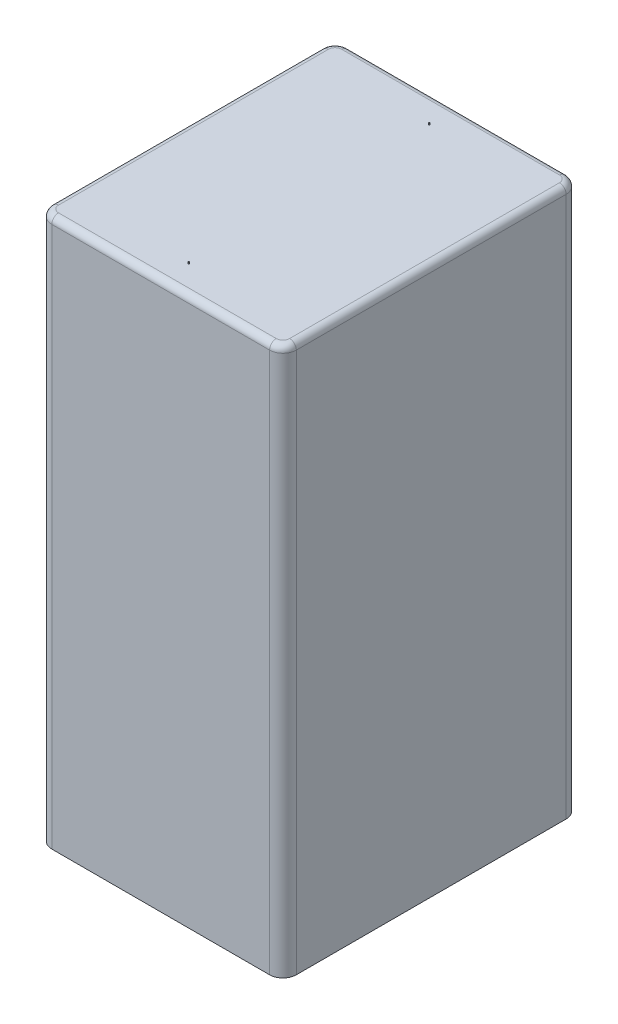
ISO-10303-21;
HEADER;
FILE_DESCRIPTION(('STEP AP214'),'2;1');
FILE_NAME('part.step','',(''),(''),'','','');
FILE_SCHEMA(('AUTOMOTIVE_DESIGN { 1 0 10303 214 1 1 1 1 }'));
ENDSEC;
DATA;
#1=APPLICATION_CONTEXT('core data for automotive mechanical design processes');
#2=APPLICATION_PROTOCOL_DEFINITION('international standard','automotive_design',2000,#1);
#3=PRODUCT_CONTEXT('',#1,'mechanical');
#4=PRODUCT('Part','Part','',(#3));
#5=PRODUCT_RELATED_PRODUCT_CATEGORY('part','',(#4));
#6=PRODUCT_DEFINITION_FORMATION('','',#4);
#7=PRODUCT_DEFINITION_CONTEXT('part definition',#1,'design');
#8=PRODUCT_DEFINITION('design','',#6,#7);
#9=PRODUCT_DEFINITION_SHAPE('','',#8);
#10=(LENGTH_UNIT() NAMED_UNIT(*) SI_UNIT(.MILLI.,.METRE.));
#11=(NAMED_UNIT(*) PLANE_ANGLE_UNIT() SI_UNIT($,.RADIAN.));
#12=(NAMED_UNIT(*) SI_UNIT($,.STERADIAN.) SOLID_ANGLE_UNIT());
#13=UNCERTAINTY_MEASURE_WITH_UNIT(LENGTH_MEASURE(1.E-05),#10,'distance_accuracy_value','');
#14=(GEOMETRIC_REPRESENTATION_CONTEXT(3) GLOBAL_UNCERTAINTY_ASSIGNED_CONTEXT((#13)) GLOBAL_UNIT_ASSIGNED_CONTEXT((#10,
#11,#12)) REPRESENTATION_CONTEXT('',''));
#15=CARTESIAN_POINT('',(0.,0.,0.));
#16=DIRECTION('',(0.,0.,1.));
#17=DIRECTION('',(1.,0.,0.));
#18=AXIS2_PLACEMENT_3D('',#15,#16,#17);
#19=CARTESIAN_POINT('',(140.172243546169,859.000000000009,970.336150462191));
#20=DIRECTION('',(0.,1.,0.));
#21=DIRECTION('',(-1.,0.,0.));
#22=AXIS2_PLACEMENT_3D('',#19,#20,#21);
#23=PLANE('',#22);
#24=CARTESIAN_POINT('',(-42.8277564538314,859.000000000009,928.336150462191));
#25=DIRECTION('',(0.,1.,0.));
#26=DIRECTION('',(-1.,0.,0.));
#27=AXIS2_PLACEMENT_3D('',#24,#25,#26);
#28=CIRCLE('',#27,1.);
#29=CARTESIAN_POINT('',(-43.8277564538314,859.000000000009,928.336150462191));
#30=VERTEX_POINT('',#29);
#31=EDGE_CURVE('E200',#30,#30,#28,.T.);
#32=ORIENTED_EDGE('',*,*,#31,.F.);
#33=EDGE_LOOP('',(#32));
#34=FACE_BOUND('',#33,.T.);
#35=DIRECTION('',(0.,0.,-1.));
#36=VECTOR('',#35,1.);
#37=CARTESIAN_POINT('',(-215.827756453831,859.000000000009,950.33615046219));
#38=LINE('',#37,#36);
#39=CARTESIAN_POINT('',(-215.827756453831,859.000000000009,546.33615046219));
#40=VERTEX_POINT('',#39);
#41=CARTESIAN_POINT('',(-215.827756453831,859.000000000009,950.33615046219));
#42=VERTEX_POINT('',#41);
#43=EDGE_CURVE('E270',#40,#42,#38,.F.);
#44=ORIENTED_EDGE('',*,*,#43,.T.);
#45=CARTESIAN_POINT('',(-205.827756453831,859.000000000009,950.33615046219));
#46=DIRECTION('',(0.,1.,0.));
#47=DIRECTION('',(-1.,0.,0.));
#48=AXIS2_PLACEMENT_3D('',#45,#46,#47);
#49=CIRCLE('',#48,10.);
#50=CARTESIAN_POINT('',(-205.827756453831,859.000000000009,960.33615046219));
#51=VERTEX_POINT('',#50);
#52=EDGE_CURVE('E272',#42,#51,#49,.T.);
#53=ORIENTED_EDGE('',*,*,#52,.T.);
#54=DIRECTION('',(-1.,0.,0.));
#55=VECTOR('',#54,1.);
#56=CARTESIAN_POINT('',(120.172243546169,859.000000000009,960.336150462191));
#57=LINE('',#56,#55);
#58=CARTESIAN_POINT('',(120.172243546169,859.000000000009,960.336150462191));
#59=VERTEX_POINT('',#58);
#60=EDGE_CURVE('E258',#51,#59,#57,.F.);
#61=ORIENTED_EDGE('',*,*,#60,.T.);
#62=CARTESIAN_POINT('',(120.172243546169,859.000000000009,950.336150462191));
#63=DIRECTION('',(0.,1.,0.));
#64=DIRECTION('',(-1.,0.,0.));
#65=AXIS2_PLACEMENT_3D('',#62,#63,#64);
#66=CIRCLE('',#65,10.);
#67=CARTESIAN_POINT('',(130.172243546169,859.000000000009,950.336150462191));
#68=VERTEX_POINT('',#67);
#69=EDGE_CURVE('E260',#59,#68,#66,.T.);
#70=ORIENTED_EDGE('',*,*,#69,.T.);
#71=DIRECTION('',(0.,0.,1.));
#72=VECTOR('',#71,1.);
#73=CARTESIAN_POINT('',(130.172243546169,859.000000000009,546.336150462191));
#74=LINE('',#73,#72);
#75=CARTESIAN_POINT('',(130.172243546169,859.000000000009,546.336150462191));
#76=VERTEX_POINT('',#75);
#77=EDGE_CURVE('E262',#68,#76,#74,.F.);
#78=ORIENTED_EDGE('',*,*,#77,.T.);
#79=CARTESIAN_POINT('',(120.172243546169,859.000000000009,546.336150462191));
#80=DIRECTION('',(0.,1.,0.));
#81=DIRECTION('',(-1.,0.,0.));
#82=AXIS2_PLACEMENT_3D('',#79,#80,#81);
#83=CIRCLE('',#82,10.);
#84=CARTESIAN_POINT('',(120.172243546169,859.000000000009,536.336150462191));
#85=VERTEX_POINT('',#84);
#86=EDGE_CURVE('E264',#76,#85,#83,.T.);
#87=ORIENTED_EDGE('',*,*,#86,.T.);
#88=DIRECTION('',(1.,0.,0.));
#89=VECTOR('',#88,1.);
#90=CARTESIAN_POINT('',(-205.827756453831,859.000000000009,536.33615046219));
#91=LINE('',#90,#89);
#92=CARTESIAN_POINT('',(-205.827756453831,859.000000000009,536.33615046219));
#93=VERTEX_POINT('',#92);
#94=EDGE_CURVE('E266',#85,#93,#91,.F.);
#95=ORIENTED_EDGE('',*,*,#94,.T.);
#96=CARTESIAN_POINT('',(-205.827756453831,859.000000000009,546.33615046219));
#97=DIRECTION('',(0.,1.,0.));
#98=DIRECTION('',(-1.,0.,0.));
#99=AXIS2_PLACEMENT_3D('',#96,#97,#98);
#100=CIRCLE('',#99,10.);
#101=EDGE_CURVE('E268',#93,#40,#100,.T.);
#102=ORIENTED_EDGE('',*,*,#101,.T.);
#103=EDGE_LOOP('',(#44,#53,#61,#70,#78,#87,#95,#102));
#104=FACE_BOUND('',#103,.T.);
#105=CARTESIAN_POINT('',(-42.8277564538313,859.000000000009,568.33615046219));
#106=DIRECTION('',(0.,1.,0.));
#107=DIRECTION('',(-1.,0.,0.));
#108=AXIS2_PLACEMENT_3D('',#105,#106,#107);
#109=CIRCLE('',#108,1.);
#110=CARTESIAN_POINT('',(-43.8277564538313,859.000000000009,568.33615046219));
#111=VERTEX_POINT('',#110);
#112=EDGE_CURVE('E196',#111,#111,#109,.T.);
#113=ORIENTED_EDGE('',*,*,#112,.F.);
#114=EDGE_LOOP('',(#113));
#115=FACE_BOUND('',#114,.T.);
#116=ADVANCED_FACE('F42',(#34,#104,#115),#23,.T.);
#117=CARTESIAN_POINT('',(140.172243546169,59.0000000000093,526.336150462191));
#118=DIRECTION('',(-1.,0.,0.));
#119=DIRECTION('',(0.,-1.,0.));
#120=AXIS2_PLACEMENT_3D('',#117,#118,#119);
#121=PLANE('',#120);
#122=DIRECTION('',(0.,1.,0.));
#123=VECTOR('',#122,1.);
#124=CARTESIAN_POINT('',(140.172243546169,59.0000000000093,546.336150462191));
#125=LINE('',#124,#123);
#126=CARTESIAN_POINT('',(140.172243546169,39.0000000000092,546.336150462191));
#127=VERTEX_POINT('',#126);
#128=CARTESIAN_POINT('',(140.172243546169,849.000000000009,546.336150462191));
#129=VERTEX_POINT('',#128);
#130=EDGE_CURVE('E156',#127,#129,#125,.T.);
#131=ORIENTED_EDGE('',*,*,#130,.T.);
#132=DIRECTION('',(0.,0.,1.));
#133=VECTOR('',#132,1.);
#134=CARTESIAN_POINT('',(140.172243546169,849.000000000009,950.336150462191));
#135=LINE('',#134,#133);
#136=CARTESIAN_POINT('',(140.172243546169,849.000000000009,950.336150462191));
#137=VERTEX_POINT('',#136);
#138=EDGE_CURVE('E67',#129,#137,#135,.T.);
#139=ORIENTED_EDGE('',*,*,#138,.T.);
#140=DIRECTION('',(0.,1.,0.));
#141=VECTOR('',#140,1.);
#142=CARTESIAN_POINT('',(140.172243546169,59.0000000000093,950.336150462191));
#143=LINE('',#142,#141);
#144=CARTESIAN_POINT('',(140.172243546169,39.0000000000093,950.336150462191));
#145=VERTEX_POINT('',#144);
#146=EDGE_CURVE('E165',#137,#145,#143,.F.);
#147=ORIENTED_EDGE('',*,*,#146,.T.);
#148=DIRECTION('',(0.,0.,1.));
#149=VECTOR('',#148,1.);
#150=CARTESIAN_POINT('',(140.172243546169,39.0000000000092,546.336150462191));
#151=LINE('',#150,#149);
#152=EDGE_CURVE('E169',#127,#145,#151,.T.);
#153=ORIENTED_EDGE('',*,*,#152,.F.);
#154=EDGE_LOOP('',(#131,#139,#147,#153));
#155=FACE_BOUND('',#154,.T.);
#156=ADVANCED_FACE('F170',(#155),#121,.F.);
#157=CARTESIAN_POINT('',(-225.827756453831,59.0000000000091,970.336150462191));
#158=DIRECTION('',(0.,0.,-1.));
#159=DIRECTION('',(0.,1.,0.));
#160=AXIS2_PLACEMENT_3D('',#157,#158,#159);
#161=PLANE('',#160);
#162=DIRECTION('',(0.,1.,0.));
#163=VECTOR('',#162,1.);
#164=CARTESIAN_POINT('',(120.172243546169,59.0000000000092,970.336150462191));
#165=LINE('',#164,#163);
#166=CARTESIAN_POINT('',(120.172243546169,39.0000000000093,970.336150462191));
#167=VERTEX_POINT('',#166);
#168=CARTESIAN_POINT('',(120.172243546169,849.000000000009,970.336150462191));
#169=VERTEX_POINT('',#168);
#170=EDGE_CURVE('E166',#167,#169,#165,.T.);
#171=ORIENTED_EDGE('',*,*,#170,.T.);
#172=DIRECTION('',(-1.,0.,0.));
#173=VECTOR('',#172,1.);
#174=CARTESIAN_POINT('',(-205.827756453831,849.000000000009,970.336150462191));
#175=LINE('',#174,#173);
#176=CARTESIAN_POINT('',(-205.827756453831,849.000000000009,970.336150462191));
#177=VERTEX_POINT('',#176);
#178=EDGE_CURVE('E12',#169,#177,#175,.T.);
#179=ORIENTED_EDGE('',*,*,#178,.T.);
#180=DIRECTION('',(0.,1.,0.));
#181=VECTOR('',#180,1.);
#182=CARTESIAN_POINT('',(-205.827756453831,59.0000000000091,970.336150462191));
#183=LINE('',#182,#181);
#184=CARTESIAN_POINT('',(-205.827756453831,39.0000000000091,970.336150462191));
#185=VERTEX_POINT('',#184);
#186=EDGE_CURVE('E244',#177,#185,#183,.F.);
#187=ORIENTED_EDGE('',*,*,#186,.T.);
#188=DIRECTION('',(-1.,0.,0.));
#189=VECTOR('',#188,1.);
#190=CARTESIAN_POINT('',(120.172243546169,39.0000000000093,970.336150462191));
#191=LINE('',#190,#189);
#192=EDGE_CURVE('E184',#167,#185,#191,.T.);
#193=ORIENTED_EDGE('',*,*,#192,.F.);
#194=EDGE_LOOP('',(#171,#179,#187,#193));
#195=FACE_BOUND('',#194,.T.);
#196=ADVANCED_FACE('F327',(#195),#161,.F.);
#197=CARTESIAN_POINT('',(-225.827756453831,59.0000000000091,526.336150462191));
#198=DIRECTION('',(1.,0.,0.));
#199=DIRECTION('',(0.,1.,0.));
#200=AXIS2_PLACEMENT_3D('',#197,#198,#199);
#201=PLANE('',#200);
#202=DIRECTION('',(0.,1.,0.));
#203=VECTOR('',#202,1.);
#204=CARTESIAN_POINT('',(-225.827756453831,59.0000000000091,950.336150462191));
#205=LINE('',#204,#203);
#206=CARTESIAN_POINT('',(-225.827756453831,39.0000000000091,950.336150462191));
#207=VERTEX_POINT('',#206);
#208=CARTESIAN_POINT('',(-225.827756453831,849.000000000009,950.33615046219));
#209=VERTEX_POINT('',#208);
#210=EDGE_CURVE('E253',#207,#209,#205,.T.);
#211=ORIENTED_EDGE('',*,*,#210,.T.);
#212=DIRECTION('',(0.,0.,-1.));
#213=VECTOR('',#212,1.);
#214=CARTESIAN_POINT('',(-225.827756453831,849.000000000009,546.33615046219));
#215=LINE('',#214,#213);
#216=CARTESIAN_POINT('',(-225.827756453831,849.000000000009,546.33615046219));
#217=VERTEX_POINT('',#216);
#218=EDGE_CURVE('E278',#209,#217,#215,.T.);
#219=ORIENTED_EDGE('',*,*,#218,.T.);
#220=DIRECTION('',(0.,1.,0.));
#221=VECTOR('',#220,1.);
#222=CARTESIAN_POINT('',(-225.827756453831,59.0000000000091,546.33615046219));
#223=LINE('',#222,#221);
#224=CARTESIAN_POINT('',(-225.827756453831,39.0000000000091,546.33615046219));
#225=VERTEX_POINT('',#224);
#226=EDGE_CURVE('E256',#217,#225,#223,.F.);
#227=ORIENTED_EDGE('',*,*,#226,.T.);
#228=DIRECTION('',(0.,0.,-1.));
#229=VECTOR('',#228,1.);
#230=CARTESIAN_POINT('',(-225.827756453831,39.0000000000091,950.336150462191));
#231=LINE('',#230,#229);
#232=EDGE_CURVE('E190',#207,#225,#231,.T.);
#233=ORIENTED_EDGE('',*,*,#232,.F.);
#234=EDGE_LOOP('',(#211,#219,#227,#233));
#235=FACE_BOUND('',#234,.T.);
#236=ADVANCED_FACE('F344',(#235),#201,.F.);
#237=CARTESIAN_POINT('',(-225.827756453831,59.0000000000091,526.336150462191));
#238=DIRECTION('',(0.,0.,1.));
#239=DIRECTION('',(0.,-1.,0.));
#240=AXIS2_PLACEMENT_3D('',#237,#238,#239);
#241=PLANE('',#240);
#242=DIRECTION('',(0.,1.,0.));
#243=VECTOR('',#242,1.);
#244=CARTESIAN_POINT('',(-205.827756453831,59.0000000000091,526.336150462191));
#245=LINE('',#244,#243);
#246=CARTESIAN_POINT('',(-205.827756453831,39.0000000000091,526.336150462191));
#247=VERTEX_POINT('',#246);
#248=CARTESIAN_POINT('',(-205.827756453831,849.000000000009,526.33615046219));
#249=VERTEX_POINT('',#248);
#250=EDGE_CURVE('E248',#247,#249,#245,.T.);
#251=ORIENTED_EDGE('',*,*,#250,.T.);
#252=DIRECTION('',(1.,0.,0.));
#253=VECTOR('',#252,1.);
#254=CARTESIAN_POINT('',(120.172243546169,849.000000000009,526.336150462191));
#255=LINE('',#254,#253);
#256=CARTESIAN_POINT('',(120.172243546169,849.000000000009,526.336150462191));
#257=VERTEX_POINT('',#256);
#258=EDGE_CURVE('E282',#249,#257,#255,.T.);
#259=ORIENTED_EDGE('',*,*,#258,.T.);
#260=DIRECTION('',(0.,1.,0.));
#261=VECTOR('',#260,1.);
#262=CARTESIAN_POINT('',(120.172243546169,59.0000000000092,526.336150462191));
#263=LINE('',#262,#261);
#264=CARTESIAN_POINT('',(120.172243546169,39.0000000000092,526.336150462191));
#265=VERTEX_POINT('',#264);
#266=EDGE_CURVE('E251',#257,#265,#263,.F.);
#267=ORIENTED_EDGE('',*,*,#266,.T.);
#268=DIRECTION('',(1.,0.,0.));
#269=VECTOR('',#268,1.);
#270=CARTESIAN_POINT('',(-205.827756453831,39.0000000000091,526.336150462191));
#271=LINE('',#270,#269);
#272=EDGE_CURVE('E180',#247,#265,#271,.T.);
#273=ORIENTED_EDGE('',*,*,#272,.F.);
#274=EDGE_LOOP('',(#251,#259,#267,#273));
#275=FACE_BOUND('',#274,.T.);
#276=ADVANCED_FACE('F406',(#275),#241,.F.);
#277=CARTESIAN_POINT('',(120.172243546169,59.0000000000092,950.336150462191));
#278=DIRECTION('',(0.,1.,0.));
#279=DIRECTION('',(-1.,0.,0.));
#280=AXIS2_PLACEMENT_3D('',#277,#278,#279);
#281=CYLINDRICAL_SURFACE('',#280,20.);
#282=ORIENTED_EDGE('',*,*,#146,.F.);
#283=CARTESIAN_POINT('',(120.172243546169,849.000000000009,950.336150462191));
#284=DIRECTION('',(0.,1.,0.));
#285=DIRECTION('',(-1.,0.,0.));
#286=AXIS2_PLACEMENT_3D('',#283,#284,#285);
#287=CIRCLE('',#286,20.);
#288=EDGE_CURVE('E52',#137,#169,#287,.F.);
#289=ORIENTED_EDGE('',*,*,#288,.T.);
#290=ORIENTED_EDGE('',*,*,#170,.F.);
#291=CARTESIAN_POINT('',(120.172243546169,39.0000000000093,950.336150462191));
#292=DIRECTION('',(0.,-1.,0.));
#293=DIRECTION('',(1.,0.,0.));
#294=AXIS2_PLACEMENT_3D('',#291,#292,#293);
#295=CIRCLE('',#294,20.);
#296=EDGE_CURVE('E174',#145,#167,#295,.T.);
#297=ORIENTED_EDGE('',*,*,#296,.F.);
#298=EDGE_LOOP('',(#282,#289,#290,#297));
#299=FACE_BOUND('',#298,.T.);
#300=ADVANCED_FACE('F409',(#299),#281,.T.);
#301=CARTESIAN_POINT('',(120.172243546169,59.0000000000092,546.336150462191));
#302=DIRECTION('',(0.,1.,0.));
#303=DIRECTION('',(-1.,0.,0.));
#304=AXIS2_PLACEMENT_3D('',#301,#302,#303);
#305=CYLINDRICAL_SURFACE('',#304,20.);
#306=ORIENTED_EDGE('',*,*,#266,.F.);
#307=CARTESIAN_POINT('',(120.172243546169,849.000000000009,546.336150462191));
#308=DIRECTION('',(0.,1.,0.));
#309=DIRECTION('',(-1.,0.,0.));
#310=AXIS2_PLACEMENT_3D('',#307,#308,#309);
#311=CIRCLE('',#310,20.);
#312=EDGE_CURVE('E163',#257,#129,#311,.F.);
#313=ORIENTED_EDGE('',*,*,#312,.T.);
#314=ORIENTED_EDGE('',*,*,#130,.F.);
#315=CARTESIAN_POINT('',(120.172243546169,39.0000000000092,546.336150462191));
#316=DIRECTION('',(0.,-1.,0.));
#317=DIRECTION('',(1.,0.,0.));
#318=AXIS2_PLACEMENT_3D('',#315,#316,#317);
#319=CIRCLE('',#318,19.9999999999999);
#320=EDGE_CURVE('E161',#265,#127,#319,.T.);
#321=ORIENTED_EDGE('',*,*,#320,.F.);
#322=EDGE_LOOP('',(#306,#313,#314,#321));
#323=FACE_BOUND('',#322,.T.);
#324=ADVANCED_FACE('F159',(#323),#305,.T.);
#325=CARTESIAN_POINT('',(-205.827756453831,59.0000000000091,546.33615046219));
#326=DIRECTION('',(0.,1.,0.));
#327=DIRECTION('',(-1.,0.,0.));
#328=AXIS2_PLACEMENT_3D('',#325,#326,#327);
#329=CYLINDRICAL_SURFACE('',#328,20.);
#330=ORIENTED_EDGE('',*,*,#226,.F.);
#331=CARTESIAN_POINT('',(-205.827756453831,849.000000000009,546.33615046219));
#332=DIRECTION('',(0.,1.,0.));
#333=DIRECTION('',(-1.,0.,0.));
#334=AXIS2_PLACEMENT_3D('',#331,#332,#333);
#335=CIRCLE('',#334,20.);
#336=EDGE_CURVE('E280',#217,#249,#335,.F.);
#337=ORIENTED_EDGE('',*,*,#336,.T.);
#338=ORIENTED_EDGE('',*,*,#250,.F.);
#339=CARTESIAN_POINT('',(-205.827756453831,39.0000000000091,546.33615046219));
#340=DIRECTION('',(0.,-1.,0.));
#341=DIRECTION('',(1.,0.,0.));
#342=AXIS2_PLACEMENT_3D('',#339,#340,#341);
#343=CIRCLE('',#342,19.9999999999999);
#344=EDGE_CURVE('E193',#225,#247,#343,.T.);
#345=ORIENTED_EDGE('',*,*,#344,.F.);
#346=EDGE_LOOP('',(#330,#337,#338,#345));
#347=FACE_BOUND('',#346,.T.);
#348=ADVANCED_FACE('F349',(#347),#329,.T.);
#349=CARTESIAN_POINT('',(-205.827756453831,59.0000000000091,950.336150462191));
#350=DIRECTION('',(0.,1.,0.));
#351=DIRECTION('',(-1.,0.,0.));
#352=AXIS2_PLACEMENT_3D('',#349,#350,#351);
#353=CYLINDRICAL_SURFACE('',#352,20.);
#354=ORIENTED_EDGE('',*,*,#186,.F.);
#355=CARTESIAN_POINT('',(-205.827756453831,849.000000000009,950.33615046219));
#356=DIRECTION('',(0.,1.,0.));
#357=DIRECTION('',(-1.,0.,0.));
#358=AXIS2_PLACEMENT_3D('',#355,#356,#357);
#359=CIRCLE('',#358,20.);
#360=EDGE_CURVE('E275',#177,#209,#359,.F.);
#361=ORIENTED_EDGE('',*,*,#360,.T.);
#362=ORIENTED_EDGE('',*,*,#210,.F.);
#363=CARTESIAN_POINT('',(-205.827756453831,39.0000000000091,950.336150462191));
#364=DIRECTION('',(0.,-1.,0.));
#365=DIRECTION('',(1.,0.,0.));
#366=AXIS2_PLACEMENT_3D('',#363,#364,#365);
#367=CIRCLE('',#366,19.9999999999999);
#368=EDGE_CURVE('E187',#185,#207,#367,.T.);
#369=ORIENTED_EDGE('',*,*,#368,.F.);
#370=EDGE_LOOP('',(#354,#361,#362,#369));
#371=FACE_BOUND('',#370,.T.);
#372=ADVANCED_FACE('F332',(#371),#353,.T.);
#373=CARTESIAN_POINT('',(120.172243546169,849.000000000009,546.336150462191));
#374=DIRECTION('',(0.,1.,0.));
#375=DIRECTION('',(-1.,0.,0.));
#376=AXIS2_PLACEMENT_3D('',#373,#374,#375);
#377=DEGENERATE_TOROIDAL_SURFACE('',#376,10.,10.,.T.);
#378=CARTESIAN_POINT('',(130.172243546169,849.000000000009,546.336150462191));
#379=DIRECTION('',(0.,0.,1.));
#380=DIRECTION('',(0.,-1.,0.));
#381=AXIS2_PLACEMENT_3D('',#378,#379,#380);
#382=CIRCLE('',#381,10.);
#383=EDGE_CURVE('E301',#129,#76,#382,.T.);
#384=ORIENTED_EDGE('',*,*,#383,.F.);
#385=ORIENTED_EDGE('',*,*,#312,.F.);
#386=CARTESIAN_POINT('',(120.172243546169,849.000000000009,536.336150462191));
#387=DIRECTION('',(-1.,0.,0.));
#388=DIRECTION('',(0.,-1.,0.));
#389=AXIS2_PLACEMENT_3D('',#386,#387,#388);
#390=CIRCLE('',#389,10.);
#391=EDGE_CURVE('E46',#85,#257,#390,.T.);
#392=ORIENTED_EDGE('',*,*,#391,.F.);
#393=ORIENTED_EDGE('',*,*,#86,.F.);
#394=EDGE_LOOP('',(#384,#385,#392,#393));
#395=FACE_BOUND('',#394,.T.);
#396=ADVANCED_FACE('F44',(#395),#377,.T.);
#397=CARTESIAN_POINT('',(-225.827756453831,849.000000000009,536.33615046219));
#398=DIRECTION('',(-1.,0.,0.));
#399=DIRECTION('',(0.,-1.,0.));
#400=AXIS2_PLACEMENT_3D('',#397,#398,#399);
#401=CYLINDRICAL_SURFACE('',#400,10.);
#402=ORIENTED_EDGE('',*,*,#391,.T.);
#403=ORIENTED_EDGE('',*,*,#258,.F.);
#404=CARTESIAN_POINT('',(-205.827756453831,849.000000000009,536.33615046219));
#405=DIRECTION('',(-1.,0.,0.));
#406=DIRECTION('',(0.,-1.,0.));
#407=AXIS2_PLACEMENT_3D('',#404,#405,#406);
#408=CIRCLE('',#407,10.);
#409=EDGE_CURVE('E299',#93,#249,#408,.T.);
#410=ORIENTED_EDGE('',*,*,#409,.F.);
#411=ORIENTED_EDGE('',*,*,#94,.F.);
#412=EDGE_LOOP('',(#402,#403,#410,#411));
#413=FACE_BOUND('',#412,.T.);
#414=ADVANCED_FACE('F310',(#413),#401,.T.);
#415=CARTESIAN_POINT('',(130.172243546169,849.000000000009,526.336150462191));
#416=DIRECTION('',(0.,0.,-1.));
#417=DIRECTION('',(0.,1.,0.));
#418=AXIS2_PLACEMENT_3D('',#415,#416,#417);
#419=CYLINDRICAL_SURFACE('',#418,10.);
#420=ORIENTED_EDGE('',*,*,#383,.T.);
#421=ORIENTED_EDGE('',*,*,#77,.F.);
#422=CARTESIAN_POINT('',(130.172243546169,849.000000000009,950.336150462191));
#423=DIRECTION('',(0.,0.,1.));
#424=DIRECTION('',(0.,-1.,0.));
#425=AXIS2_PLACEMENT_3D('',#422,#423,#424);
#426=CIRCLE('',#425,10.);
#427=EDGE_CURVE('E296',#137,#68,#426,.T.);
#428=ORIENTED_EDGE('',*,*,#427,.F.);
#429=ORIENTED_EDGE('',*,*,#138,.F.);
#430=EDGE_LOOP('',(#420,#421,#428,#429));
#431=FACE_BOUND('',#430,.T.);
#432=ADVANCED_FACE('F315',(#431),#419,.T.);
#433=CARTESIAN_POINT('',(-205.827756453831,849.000000000009,546.33615046219));
#434=DIRECTION('',(0.,1.,0.));
#435=DIRECTION('',(-1.,0.,0.));
#436=AXIS2_PLACEMENT_3D('',#433,#434,#435);
#437=DEGENERATE_TOROIDAL_SURFACE('',#436,10.,10.,.T.);
#438=ORIENTED_EDGE('',*,*,#409,.T.);
#439=ORIENTED_EDGE('',*,*,#336,.F.);
#440=CARTESIAN_POINT('',(-215.827756453831,849.000000000009,546.33615046219));
#441=DIRECTION('',(0.,0.,1.));
#442=DIRECTION('',(0.,-1.,0.));
#443=AXIS2_PLACEMENT_3D('',#440,#441,#442);
#444=CIRCLE('',#443,10.);
#445=EDGE_CURVE('E293',#40,#217,#444,.T.);
#446=ORIENTED_EDGE('',*,*,#445,.F.);
#447=ORIENTED_EDGE('',*,*,#101,.F.);
#448=EDGE_LOOP('',(#438,#439,#446,#447));
#449=FACE_BOUND('',#448,.T.);
#450=ADVANCED_FACE('F351',(#449),#437,.T.);
#451=CARTESIAN_POINT('',(120.172243546169,849.000000000009,950.336150462191));
#452=DIRECTION('',(0.,1.,0.));
#453=DIRECTION('',(-1.,0.,0.));
#454=AXIS2_PLACEMENT_3D('',#451,#452,#453);
#455=DEGENERATE_TOROIDAL_SURFACE('',#454,10.,10.,.T.);
#456=ORIENTED_EDGE('',*,*,#427,.T.);
#457=ORIENTED_EDGE('',*,*,#69,.F.);
#458=CARTESIAN_POINT('',(120.172243546169,849.000000000009,960.336150462191));
#459=DIRECTION('',(-1.,0.,0.));
#460=DIRECTION('',(0.,-1.,0.));
#461=AXIS2_PLACEMENT_3D('',#458,#459,#460);
#462=CIRCLE('',#461,10.);
#463=EDGE_CURVE('E290',#169,#59,#462,.T.);
#464=ORIENTED_EDGE('',*,*,#463,.F.);
#465=ORIENTED_EDGE('',*,*,#288,.F.);
#466=EDGE_LOOP('',(#456,#457,#464,#465));
#467=FACE_BOUND('',#466,.T.);
#468=ADVANCED_FACE('F319',(#467),#455,.T.);
#469=CARTESIAN_POINT('',(-215.827756453831,849.000000000009,526.33615046219));
#470=DIRECTION('',(0.,0.,1.));
#471=DIRECTION('',(0.,-1.,0.));
#472=AXIS2_PLACEMENT_3D('',#469,#470,#471);
#473=CYLINDRICAL_SURFACE('',#472,10.);
#474=ORIENTED_EDGE('',*,*,#445,.T.);
#475=ORIENTED_EDGE('',*,*,#218,.F.);
#476=CARTESIAN_POINT('',(-215.827756453831,849.000000000009,950.33615046219));
#477=DIRECTION('',(0.,0.,1.));
#478=DIRECTION('',(0.,-1.,0.));
#479=AXIS2_PLACEMENT_3D('',#476,#477,#478);
#480=CIRCLE('',#479,10.);
#481=EDGE_CURVE('E288',#42,#209,#480,.T.);
#482=ORIENTED_EDGE('',*,*,#481,.F.);
#483=ORIENTED_EDGE('',*,*,#43,.F.);
#484=EDGE_LOOP('',(#474,#475,#482,#483));
#485=FACE_BOUND('',#484,.T.);
#486=ADVANCED_FACE('F340',(#485),#473,.T.);
#487=CARTESIAN_POINT('',(-225.827756453831,849.000000000009,960.33615046219));
#488=DIRECTION('',(1.,0.,0.));
#489=DIRECTION('',(0.,1.,0.));
#490=AXIS2_PLACEMENT_3D('',#487,#488,#489);
#491=CYLINDRICAL_SURFACE('',#490,10.);
#492=ORIENTED_EDGE('',*,*,#463,.T.);
#493=ORIENTED_EDGE('',*,*,#60,.F.);
#494=CARTESIAN_POINT('',(-205.827756453831,849.000000000009,960.33615046219));
#495=DIRECTION('',(-1.,0.,0.));
#496=DIRECTION('',(0.,-1.,0.));
#497=AXIS2_PLACEMENT_3D('',#494,#495,#496);
#498=CIRCLE('',#497,10.);
#499=EDGE_CURVE('E206',#177,#51,#498,.T.);
#500=ORIENTED_EDGE('',*,*,#499,.F.);
#501=ORIENTED_EDGE('',*,*,#178,.F.);
#502=EDGE_LOOP('',(#492,#493,#500,#501));
#503=FACE_BOUND('',#502,.T.);
#504=ADVANCED_FACE('F324',(#503),#491,.T.);
#505=CARTESIAN_POINT('',(-205.827756453831,849.000000000009,950.33615046219));
#506=DIRECTION('',(0.,1.,0.));
#507=DIRECTION('',(-1.,0.,0.));
#508=AXIS2_PLACEMENT_3D('',#505,#506,#507);
#509=DEGENERATE_TOROIDAL_SURFACE('',#508,10.,10.,.T.);
#510=ORIENTED_EDGE('',*,*,#481,.T.);
#511=ORIENTED_EDGE('',*,*,#360,.F.);
#512=ORIENTED_EDGE('',*,*,#499,.T.);
#513=ORIENTED_EDGE('',*,*,#52,.F.);
#514=EDGE_LOOP('',(#510,#511,#512,#513));
#515=FACE_BOUND('',#514,.T.);
#516=ADVANCED_FACE('F334',(#515),#509,.T.);
#517=CARTESIAN_POINT('',(-42.8277564538314,861.000000000009,928.336150462191));
#518=DIRECTION('',(0.,-1.,0.));
#519=DIRECTION('',(1.,0.,0.));
#520=AXIS2_PLACEMENT_3D('',#517,#518,#519);
#521=CYLINDRICAL_SURFACE('',#520,1.);
#522=CARTESIAN_POINT('',(-42.8277564538314,861.000000000009,928.336150462191));
#523=DIRECTION('',(0.,1.,0.));
#524=DIRECTION('',(-1.,0.,0.));
#525=AXIS2_PLACEMENT_3D('',#522,#523,#524);
#526=CIRCLE('',#525,1.);
#527=CARTESIAN_POINT('',(-43.8277564538314,861.000000000009,928.336150462191));
#528=VERTEX_POINT('',#527);
#529=EDGE_CURVE('E203',#528,#528,#526,.T.);
#530=ORIENTED_EDGE('',*,*,#529,.F.);
#531=EDGE_LOOP('',(#530));
#532=FACE_BOUND('',#531,.T.);
#533=ORIENTED_EDGE('',*,*,#31,.T.);
#534=EDGE_LOOP('',(#533));
#535=FACE_BOUND('',#534,.T.);
#536=ADVANCED_FACE('F372',(#532,#535),#521,.T.);
#537=CARTESIAN_POINT('',(-42.8277564538314,861.000000000009,928.336150462191));
#538=DIRECTION('',(0.,1.,0.));
#539=DIRECTION('',(-1.,0.,0.));
#540=AXIS2_PLACEMENT_3D('',#537,#538,#539);
#541=PLANE('',#540);
#542=ORIENTED_EDGE('',*,*,#529,.T.);
#543=EDGE_LOOP('',(#542));
#544=FACE_BOUND('',#543,.T.);
#545=ADVANCED_FACE('F363',(#544),#541,.T.);
#546=CARTESIAN_POINT('',(-42.8277564538313,861.000000000009,568.33615046219));
#547=DIRECTION('',(0.,-1.,0.));
#548=DIRECTION('',(1.,0.,0.));
#549=AXIS2_PLACEMENT_3D('',#546,#547,#548);
#550=CYLINDRICAL_SURFACE('',#549,1.);
#551=CARTESIAN_POINT('',(-42.8277564538313,861.000000000009,568.33615046219));
#552=DIRECTION('',(0.,1.,0.));
#553=DIRECTION('',(-1.,0.,0.));
#554=AXIS2_PLACEMENT_3D('',#551,#552,#553);
#555=CIRCLE('',#554,1.);
#556=CARTESIAN_POINT('',(-43.8277564538313,861.000000000009,568.33615046219));
#557=VERTEX_POINT('',#556);
#558=EDGE_CURVE('E197',#557,#557,#555,.T.);
#559=ORIENTED_EDGE('',*,*,#558,.F.);
#560=EDGE_LOOP('',(#559));
#561=FACE_BOUND('',#560,.T.);
#562=ORIENTED_EDGE('',*,*,#112,.T.);
#563=EDGE_LOOP('',(#562));
#564=FACE_BOUND('',#563,.T.);
#565=ADVANCED_FACE('F360',(#561,#564),#550,.T.);
#566=CARTESIAN_POINT('',(-42.8277564538313,861.000000000009,568.33615046219));
#567=DIRECTION('',(0.,1.,0.));
#568=DIRECTION('',(-1.,0.,0.));
#569=AXIS2_PLACEMENT_3D('',#566,#567,#568);
#570=PLANE('',#569);
#571=ORIENTED_EDGE('',*,*,#558,.T.);
#572=EDGE_LOOP('',(#571));
#573=FACE_BOUND('',#572,.T.);
#574=ADVANCED_FACE('F362',(#573),#570,.T.);
#575=CARTESIAN_POINT('',(120.172243546169,39.0000000000092,546.336150462191));
#576=DIRECTION('',(0.,-1.,0.));
#577=DIRECTION('',(1.,0.,0.));
#578=AXIS2_PLACEMENT_3D('',#575,#576,#577);
#579=PLANE('',#578);
#580=ORIENTED_EDGE('',*,*,#320,.T.);
#581=ORIENTED_EDGE('',*,*,#152,.T.);
#582=ORIENTED_EDGE('',*,*,#296,.T.);
#583=ORIENTED_EDGE('',*,*,#192,.T.);
#584=ORIENTED_EDGE('',*,*,#368,.T.);
#585=ORIENTED_EDGE('',*,*,#232,.T.);
#586=ORIENTED_EDGE('',*,*,#344,.T.);
#587=ORIENTED_EDGE('',*,*,#272,.T.);
#588=EDGE_LOOP('',(#580,#581,#582,#583,#584,#585,#586,#587));
#589=FACE_BOUND('',#588,.T.);
#590=ADVANCED_FACE('F177',(#589),#579,.T.);
#591=CLOSED_SHELL('',(#116,#156,#196,#236,#276,#300,#324,#348,#372,#396,#414,#432,#450,#468,
#486,#504,#516,#536,#545,#565,#574,#590));
#592=CARTESIAN_POINT('',(-225.827756453831,69.0000000000091,526.336150462191));
#593=DIRECTION('',(0.,-1.,0.));
#594=DIRECTION('',(1.,0.,0.));
#595=AXIS2_PLACEMENT_3D('',#592,#593,#594);
#596=PLANE('',#595);
#597=DIRECTION('',(1.,0.,0.));
#598=VECTOR('',#597,1.);
#599=CARTESIAN_POINT('',(130.172243546169,69.0000000000092,960.336150462191));
#600=LINE('',#599,#598);
#601=CARTESIAN_POINT('',(-215.827756453831,69.0000000000091,960.33615046219));
#602=VERTEX_POINT('',#601);
#603=CARTESIAN_POINT('',(130.172243546169,69.0000000000092,960.336150462191));
#604=VERTEX_POINT('',#603);
#605=EDGE_CURVE('E212',#602,#604,#600,.T.);
#606=ORIENTED_EDGE('',*,*,#605,.T.);
#607=DIRECTION('',(0.,0.,-1.));
#608=VECTOR('',#607,1.);
#609=CARTESIAN_POINT('',(130.172243546169,69.0000000000092,536.336150462191));
#610=LINE('',#609,#608);
#611=CARTESIAN_POINT('',(130.172243546169,69.0000000000092,536.336150462191));
#612=VERTEX_POINT('',#611);
#613=EDGE_CURVE('E215',#604,#612,#610,.T.);
#614=ORIENTED_EDGE('',*,*,#613,.T.);
#615=DIRECTION('',(-1.,0.,0.));
#616=VECTOR('',#615,1.);
#617=CARTESIAN_POINT('',(-215.827756453831,69.0000000000091,536.33615046219));
#618=LINE('',#617,#616);
#619=CARTESIAN_POINT('',(-215.827756453831,69.0000000000091,536.33615046219));
#620=VERTEX_POINT('',#619);
#621=EDGE_CURVE('E241',#612,#620,#618,.T.);
#622=ORIENTED_EDGE('',*,*,#621,.T.);
#623=DIRECTION('',(0.,0.,1.));
#624=VECTOR('',#623,1.);
#625=CARTESIAN_POINT('',(-215.827756453831,69.0000000000091,960.33615046219));
#626=LINE('',#625,#624);
#627=EDGE_CURVE('E209',#620,#602,#626,.T.);
#628=ORIENTED_EDGE('',*,*,#627,.T.);
#629=EDGE_LOOP('',(#606,#614,#622,#628));
#630=FACE_BOUND('',#629,.T.);
#631=ADVANCED_FACE('F381',(#630),#596,.F.);
#632=CARTESIAN_POINT('',(140.172243546169,849.000000000009,970.336150462191));
#633=DIRECTION('',(0.,1.,0.));
#634=DIRECTION('',(-1.,0.,0.));
#635=AXIS2_PLACEMENT_3D('',#632,#633,#634);
#636=PLANE('',#635);
#637=DIRECTION('',(1.,0.,0.));
#638=VECTOR('',#637,1.);
#639=CARTESIAN_POINT('',(-215.827756453831,849.000000000009,536.33615046219));
#640=LINE('',#639,#638);
#641=CARTESIAN_POINT('',(-215.827756453831,849.000000000009,536.33615046219));
#642=VERTEX_POINT('',#641);
#643=CARTESIAN_POINT('',(130.172243546169,849.000000000009,536.336150462191));
#644=VERTEX_POINT('',#643);
#645=EDGE_CURVE('E222',#642,#644,#640,.T.);
#646=ORIENTED_EDGE('',*,*,#645,.T.);
#647=DIRECTION('',(0.,0.,1.));
#648=VECTOR('',#647,1.);
#649=CARTESIAN_POINT('',(130.172243546169,849.000000000009,536.336150462191));
#650=LINE('',#649,#648);
#651=CARTESIAN_POINT('',(130.172243546169,849.000000000009,960.336150462191));
#652=VERTEX_POINT('',#651);
#653=EDGE_CURVE('E218',#644,#652,#650,.T.);
#654=ORIENTED_EDGE('',*,*,#653,.T.);
#655=DIRECTION('',(-1.,0.,0.));
#656=VECTOR('',#655,1.);
#657=CARTESIAN_POINT('',(130.172243546169,849.000000000009,960.336150462191));
#658=LINE('',#657,#656);
#659=CARTESIAN_POINT('',(-215.827756453831,849.000000000009,960.33615046219));
#660=VERTEX_POINT('',#659);
#661=EDGE_CURVE('E231',#652,#660,#658,.T.);
#662=ORIENTED_EDGE('',*,*,#661,.T.);
#663=DIRECTION('',(0.,0.,-1.));
#664=VECTOR('',#663,1.);
#665=CARTESIAN_POINT('',(-215.827756453831,849.000000000009,960.33615046219));
#666=LINE('',#665,#664);
#667=EDGE_CURVE('E227',#660,#642,#666,.T.);
#668=ORIENTED_EDGE('',*,*,#667,.T.);
#669=EDGE_LOOP('',(#646,#654,#662,#668));
#670=FACE_BOUND('',#669,.T.);
#671=ADVANCED_FACE('F384',(#670),#636,.F.);
#672=CARTESIAN_POINT('',(-215.827756453831,1406.25862259083,536.33615046219));
#673=DIRECTION('',(0.,0.,-1.));
#674=DIRECTION('',(0.,1.,0.));
#675=AXIS2_PLACEMENT_3D('',#672,#673,#674);
#676=PLANE('',#675);
#677=ORIENTED_EDGE('',*,*,#621,.F.);
#678=DIRECTION('',(0.,-1.,0.));
#679=VECTOR('',#678,1.);
#680=CARTESIAN_POINT('',(130.172243546169,1406.25862259083,536.336150462191));
#681=LINE('',#680,#679);
#682=EDGE_CURVE('E225',#644,#612,#681,.T.);
#683=ORIENTED_EDGE('',*,*,#682,.F.);
#684=ORIENTED_EDGE('',*,*,#645,.F.);
#685=DIRECTION('',(0.,-1.,0.));
#686=VECTOR('',#685,1.);
#687=CARTESIAN_POINT('',(-215.827756453831,1406.25862259083,536.33615046219));
#688=LINE('',#687,#686);
#689=EDGE_CURVE('E226',#642,#620,#688,.T.);
#690=ORIENTED_EDGE('',*,*,#689,.T.);
#691=EDGE_LOOP('',(#677,#683,#684,#690));
#692=FACE_BOUND('',#691,.T.);
#693=ADVANCED_FACE('F387',(#692),#676,.F.);
#694=CARTESIAN_POINT('',(-215.827756453831,1406.25862259083,960.33615046219));
#695=DIRECTION('',(-1.,0.,0.));
#696=DIRECTION('',(0.,-1.,0.));
#697=AXIS2_PLACEMENT_3D('',#694,#695,#696);
#698=PLANE('',#697);
#699=ORIENTED_EDGE('',*,*,#627,.F.);
#700=ORIENTED_EDGE('',*,*,#689,.F.);
#701=ORIENTED_EDGE('',*,*,#667,.F.);
#702=DIRECTION('',(0.,-1.,0.));
#703=VECTOR('',#702,1.);
#704=CARTESIAN_POINT('',(-215.827756453831,1406.25862259083,960.33615046219));
#705=LINE('',#704,#703);
#706=EDGE_CURVE('E230',#660,#602,#705,.T.);
#707=ORIENTED_EDGE('',*,*,#706,.T.);
#708=EDGE_LOOP('',(#699,#700,#701,#707));
#709=FACE_BOUND('',#708,.T.);
#710=ADVANCED_FACE('F390',(#709),#698,.F.);
#711=CARTESIAN_POINT('',(130.172243546168,1406.25862259083,960.33615046219));
#712=DIRECTION('',(0.,0.,1.));
#713=DIRECTION('',(0.,-1.,0.));
#714=AXIS2_PLACEMENT_3D('',#711,#712,#713);
#715=PLANE('',#714);
#716=ORIENTED_EDGE('',*,*,#605,.F.);
#717=ORIENTED_EDGE('',*,*,#706,.F.);
#718=ORIENTED_EDGE('',*,*,#661,.F.);
#719=DIRECTION('',(0.,-1.,0.));
#720=VECTOR('',#719,1.);
#721=CARTESIAN_POINT('',(130.172243546168,1406.25862259083,960.33615046219));
#722=LINE('',#721,#720);
#723=EDGE_CURVE('E221',#652,#604,#722,.T.);
#724=ORIENTED_EDGE('',*,*,#723,.T.);
#725=EDGE_LOOP('',(#716,#717,#718,#724));
#726=FACE_BOUND('',#725,.T.);
#727=ADVANCED_FACE('F394',(#726),#715,.F.);
#728=CARTESIAN_POINT('',(130.172243546169,1406.25862259083,536.336150462191));
#729=DIRECTION('',(1.,0.,0.));
#730=DIRECTION('',(0.,1.,0.));
#731=AXIS2_PLACEMENT_3D('',#728,#729,#730);
#732=PLANE('',#731);
#733=ORIENTED_EDGE('',*,*,#613,.F.);
#734=ORIENTED_EDGE('',*,*,#723,.F.);
#735=ORIENTED_EDGE('',*,*,#653,.F.);
#736=ORIENTED_EDGE('',*,*,#682,.T.);
#737=EDGE_LOOP('',(#733,#734,#735,#736));
#738=FACE_BOUND('',#737,.T.);
#739=ADVANCED_FACE('F398',(#738),#732,.F.);
#740=CLOSED_SHELL('',(#631,#671,#693,#710,#727,#739));
#741=ORIENTED_CLOSED_SHELL('',*,#740,.T.);
#742=BREP_WITH_VOIDS('B2',#591,(#741));
#743=ADVANCED_BREP_SHAPE_REPRESENTATION('',(#18,#742),#14);
#744=SHAPE_DEFINITION_REPRESENTATION(#9,#743);
ENDSEC;
END-ISO-10303-21;
